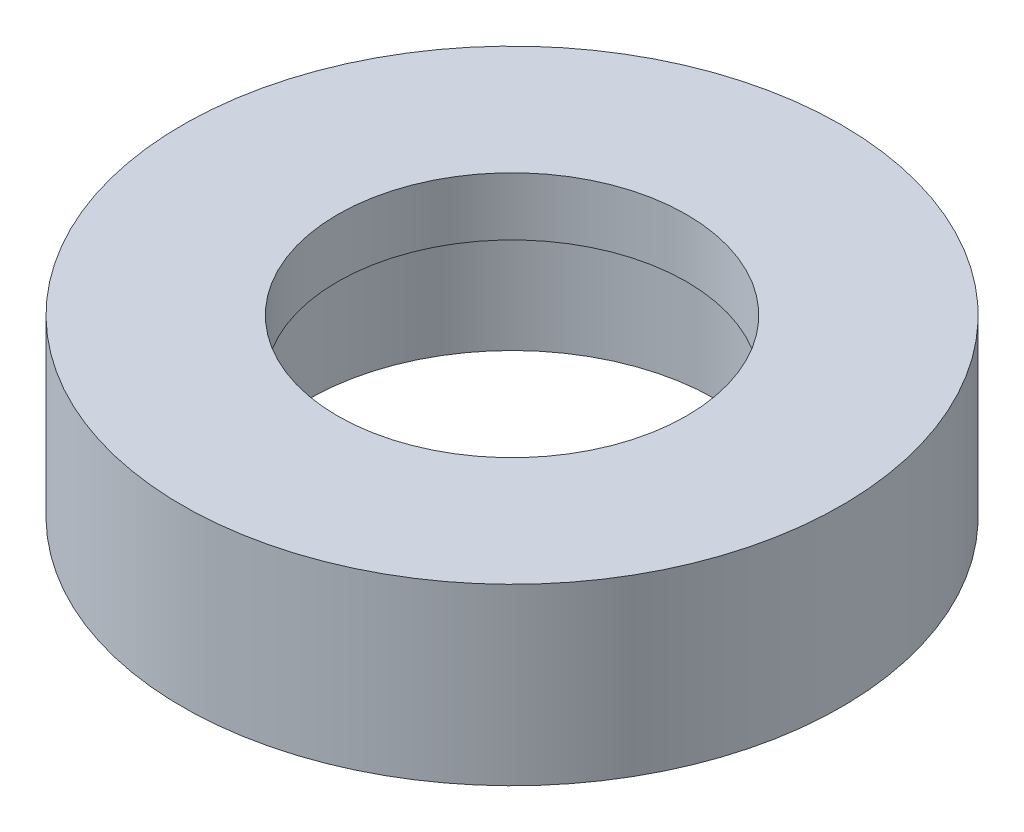
ISO-10303-21;
HEADER;
FILE_DESCRIPTION(('STEP AP214'),'2;1');
FILE_NAME('part.step','',(''),(''),'','','');
FILE_SCHEMA(('AUTOMOTIVE_DESIGN { 1 0 10303 214 1 1 1 1 }'));
ENDSEC;
DATA;
#1=APPLICATION_CONTEXT('core data for automotive mechanical design processes');
#2=APPLICATION_PROTOCOL_DEFINITION('international standard','automotive_design',2000,#1);
#3=PRODUCT_CONTEXT('',#1,'mechanical');
#4=PRODUCT('Part','Part','',(#3));
#5=PRODUCT_RELATED_PRODUCT_CATEGORY('part','',(#4));
#6=PRODUCT_DEFINITION_FORMATION('','',#4);
#7=PRODUCT_DEFINITION_CONTEXT('part definition',#1,'design');
#8=PRODUCT_DEFINITION('design','',#6,#7);
#9=PRODUCT_DEFINITION_SHAPE('','',#8);
#10=(LENGTH_UNIT() NAMED_UNIT(*) SI_UNIT(.MILLI.,.METRE.));
#11=(NAMED_UNIT(*) PLANE_ANGLE_UNIT() SI_UNIT($,.RADIAN.));
#12=(NAMED_UNIT(*) SI_UNIT($,.STERADIAN.) SOLID_ANGLE_UNIT());
#13=UNCERTAINTY_MEASURE_WITH_UNIT(LENGTH_MEASURE(1.E-05),#10,'distance_accuracy_value','');
#14=(GEOMETRIC_REPRESENTATION_CONTEXT(3) GLOBAL_UNCERTAINTY_ASSIGNED_CONTEXT((#13)) GLOBAL_UNIT_ASSIGNED_CONTEXT((#10,
#11,#12)) REPRESENTATION_CONTEXT('',''));
#15=CARTESIAN_POINT('',(0.,0.,0.));
#16=DIRECTION('',(0.,0.,1.));
#17=DIRECTION('',(1.,0.,0.));
#18=AXIS2_PLACEMENT_3D('',#15,#16,#17);
#19=CARTESIAN_POINT('',(0.,0.,0.));
#20=DIRECTION('',(0.,-1.,0.));
#21=DIRECTION('',(0.,0.,-1.));
#22=AXIS2_PLACEMENT_3D('',#19,#20,#21);
#23=CYLINDRICAL_SURFACE('',#22,34.);
#24=CARTESIAN_POINT('',(0.,-0.499416231257493,0.));
#25=DIRECTION('',(0.,-1.,0.));
#26=DIRECTION('',(0.,0.,-1.));
#27=AXIS2_PLACEMENT_3D('',#24,#25,#26);
#28=CIRCLE('',#27,34.);
#29=CARTESIAN_POINT('',(0.,-0.499416231257493,-34.));
#30=VERTEX_POINT('',#29);
#31=EDGE_CURVE('E10',#30,#30,#28,.T.);
#32=ORIENTED_EDGE('',*,*,#31,.F.);
#33=EDGE_LOOP('',(#32));
#34=FACE_BOUND('',#33,.T.);
#35=CARTESIAN_POINT('',(0.,17.5005837687425,0.));
#36=DIRECTION('',(0.,-1.,0.));
#37=DIRECTION('',(0.,0.,-1.));
#38=AXIS2_PLACEMENT_3D('',#35,#36,#37);
#39=CIRCLE('',#38,34.);
#40=CARTESIAN_POINT('',(0.,17.5005837687425,-34.));
#41=VERTEX_POINT('',#40);
#42=EDGE_CURVE('E52',#41,#41,#39,.T.);
#43=ORIENTED_EDGE('',*,*,#42,.T.);
#44=EDGE_LOOP('',(#43));
#45=FACE_BOUND('',#44,.T.);
#46=ADVANCED_FACE('F30',(#34,#45),#23,.T.);
#47=CARTESIAN_POINT('',(-34.,-0.499416231257493,0.));
#48=DIRECTION('',(0.,1.,0.));
#49=DIRECTION('',(0.,0.,1.));
#50=AXIS2_PLACEMENT_3D('',#47,#48,#49);
#51=PLANE('',#50);
#52=CARTESIAN_POINT('',(0.,-0.499416231257493,27.6));
#53=DIRECTION('',(0.,-1.,0.));
#54=DIRECTION('',(0.,0.,-1.));
#55=AXIS2_PLACEMENT_3D('',#52,#53,#54);
#56=CIRCLE('',#55,3.);
#57=CARTESIAN_POINT('',(0.,-0.499416231257493,24.6));
#58=VERTEX_POINT('',#57);
#59=EDGE_CURVE('E74',#58,#58,#56,.T.);
#60=ORIENTED_EDGE('',*,*,#59,.F.);
#61=EDGE_LOOP('',(#60));
#62=FACE_BOUND('',#61,.T.);
#63=CARTESIAN_POINT('',(27.6,-0.499416231257493,0.));
#64=DIRECTION('',(0.,-1.,0.));
#65=DIRECTION('',(0.,0.,-1.));
#66=AXIS2_PLACEMENT_3D('',#63,#64,#65);
#67=CIRCLE('',#66,3.);
#68=CARTESIAN_POINT('',(27.6,-0.499416231257493,-3.));
#69=VERTEX_POINT('',#68);
#70=EDGE_CURVE('E68',#69,#69,#67,.T.);
#71=ORIENTED_EDGE('',*,*,#70,.F.);
#72=EDGE_LOOP('',(#71));
#73=FACE_BOUND('',#72,.T.);
#74=CARTESIAN_POINT('',(0.,-0.499416231257493,-27.6));
#75=DIRECTION('',(0.,-1.,0.));
#76=DIRECTION('',(0.,0.,-1.));
#77=AXIS2_PLACEMENT_3D('',#74,#75,#76);
#78=CIRCLE('',#77,3.);
#79=CARTESIAN_POINT('',(0.,-0.499416231257493,-30.6));
#80=VERTEX_POINT('',#79);
#81=EDGE_CURVE('E62',#80,#80,#78,.T.);
#82=ORIENTED_EDGE('',*,*,#81,.F.);
#83=EDGE_LOOP('',(#82));
#84=FACE_BOUND('',#83,.T.);
#85=CARTESIAN_POINT('',(-27.6,-0.499416231257493,0.));
#86=DIRECTION('',(0.,-1.,0.));
#87=DIRECTION('',(0.,0.,-1.));
#88=AXIS2_PLACEMENT_3D('',#85,#86,#87);
#89=CIRCLE('',#88,3.);
#90=CARTESIAN_POINT('',(-27.6,-0.499416231257493,-3.));
#91=VERTEX_POINT('',#90);
#92=EDGE_CURVE('E56',#91,#91,#89,.T.);
#93=ORIENTED_EDGE('',*,*,#92,.F.);
#94=EDGE_LOOP('',(#93));
#95=FACE_BOUND('',#94,.T.);
#96=CARTESIAN_POINT('',(0.,-0.499416231257493,0.));
#97=DIRECTION('',(0.,-1.,0.));
#98=DIRECTION('',(0.,0.,-1.));
#99=AXIS2_PLACEMENT_3D('',#96,#97,#98);
#100=CIRCLE('',#99,21.);
#101=CARTESIAN_POINT('',(0.,-0.499416231257493,-21.));
#102=VERTEX_POINT('',#101);
#103=EDGE_CURVE('E36',#102,#102,#100,.T.);
#104=ORIENTED_EDGE('',*,*,#103,.F.);
#105=EDGE_LOOP('',(#104));
#106=FACE_BOUND('',#105,.T.);
#107=ORIENTED_EDGE('',*,*,#31,.T.);
#108=EDGE_LOOP('',(#107));
#109=FACE_BOUND('',#108,.T.);
#110=ADVANCED_FACE('F89',(#62,#73,#84,#95,#106,#109),#51,.F.);
#111=CARTESIAN_POINT('',(0.,0.,0.));
#112=DIRECTION('',(0.,-1.,0.));
#113=DIRECTION('',(0.,0.,-1.));
#114=AXIS2_PLACEMENT_3D('',#111,#112,#113);
#115=CYLINDRICAL_SURFACE('',#114,21.);
#116=CARTESIAN_POINT('',(0.,11.5005837687425,0.));
#117=DIRECTION('',(0.,-1.,0.));
#118=DIRECTION('',(0.,0.,-1.));
#119=AXIS2_PLACEMENT_3D('',#116,#117,#118);
#120=CIRCLE('',#119,21.);
#121=CARTESIAN_POINT('',(0.,11.5005837687425,-21.));
#122=VERTEX_POINT('',#121);
#123=EDGE_CURVE('E40',#122,#122,#120,.T.);
#124=ORIENTED_EDGE('',*,*,#123,.F.);
#125=EDGE_LOOP('',(#124));
#126=FACE_BOUND('',#125,.T.);
#127=ORIENTED_EDGE('',*,*,#103,.T.);
#128=EDGE_LOOP('',(#127));
#129=FACE_BOUND('',#128,.T.);
#130=ADVANCED_FACE('F92',(#126,#129),#115,.F.);
#131=CARTESIAN_POINT('',(-21.,11.5005837687425,0.));
#132=DIRECTION('',(0.,1.,0.));
#133=DIRECTION('',(0.,0.,1.));
#134=AXIS2_PLACEMENT_3D('',#131,#132,#133);
#135=PLANE('',#134);
#136=CARTESIAN_POINT('',(0.,11.5005837687425,0.));
#137=DIRECTION('',(0.,-1.,0.));
#138=DIRECTION('',(0.,0.,-1.));
#139=AXIS2_PLACEMENT_3D('',#136,#137,#138);
#140=CIRCLE('',#139,18.);
#141=CARTESIAN_POINT('',(0.,11.5005837687425,-18.));
#142=VERTEX_POINT('',#141);
#143=EDGE_CURVE('E44',#142,#142,#140,.T.);
#144=ORIENTED_EDGE('',*,*,#143,.F.);
#145=EDGE_LOOP('',(#144));
#146=FACE_BOUND('',#145,.T.);
#147=ORIENTED_EDGE('',*,*,#123,.T.);
#148=EDGE_LOOP('',(#147));
#149=FACE_BOUND('',#148,.T.);
#150=ADVANCED_FACE('F128',(#146,#149),#135,.F.);
#151=CARTESIAN_POINT('',(0.,0.,0.));
#152=DIRECTION('',(0.,-1.,0.));
#153=DIRECTION('',(0.,0.,-1.));
#154=AXIS2_PLACEMENT_3D('',#151,#152,#153);
#155=CYLINDRICAL_SURFACE('',#154,18.);
#156=CARTESIAN_POINT('',(0.,17.5005837687425,0.));
#157=DIRECTION('',(0.,-1.,0.));
#158=DIRECTION('',(0.,0.,-1.));
#159=AXIS2_PLACEMENT_3D('',#156,#157,#158);
#160=CIRCLE('',#159,18.);
#161=CARTESIAN_POINT('',(0.,17.5005837687425,-18.));
#162=VERTEX_POINT('',#161);
#163=EDGE_CURVE('E49',#162,#162,#160,.T.);
#164=ORIENTED_EDGE('',*,*,#163,.F.);
#165=EDGE_LOOP('',(#164));
#166=FACE_BOUND('',#165,.T.);
#167=ORIENTED_EDGE('',*,*,#143,.T.);
#168=EDGE_LOOP('',(#167));
#169=FACE_BOUND('',#168,.T.);
#170=ADVANCED_FACE('F113',(#166,#169),#155,.F.);
#171=CARTESIAN_POINT('',(-18.,17.5005837687425,0.));
#172=DIRECTION('',(0.,-1.,0.));
#173=DIRECTION('',(0.,0.,-1.));
#174=AXIS2_PLACEMENT_3D('',#171,#172,#173);
#175=PLANE('',#174);
#176=ORIENTED_EDGE('',*,*,#42,.F.);
#177=EDGE_LOOP('',(#176));
#178=FACE_BOUND('',#177,.T.);
#179=ORIENTED_EDGE('',*,*,#163,.T.);
#180=EDGE_LOOP('',(#179));
#181=FACE_BOUND('',#180,.T.);
#182=ADVANCED_FACE('F103',(#178,#181),#175,.F.);
#183=CARTESIAN_POINT('',(-27.6,9.50058376874251,0.));
#184=DIRECTION('',(0.,-1.,0.));
#185=DIRECTION('',(0.,0.,-1.));
#186=AXIS2_PLACEMENT_3D('',#183,#184,#185);
#187=CYLINDRICAL_SURFACE('',#186,3.);
#188=CARTESIAN_POINT('',(-27.6,9.50058376874251,0.));
#189=DIRECTION('',(0.,-1.,0.));
#190=DIRECTION('',(0.,0.,-1.));
#191=AXIS2_PLACEMENT_3D('',#188,#189,#190);
#192=CIRCLE('',#191,3.);
#193=CARTESIAN_POINT('',(-27.6,9.50058376874251,-3.));
#194=VERTEX_POINT('',#193);
#195=EDGE_CURVE('E59',#194,#194,#192,.T.);
#196=ORIENTED_EDGE('',*,*,#195,.F.);
#197=EDGE_LOOP('',(#196));
#198=FACE_BOUND('',#197,.T.);
#199=ORIENTED_EDGE('',*,*,#92,.T.);
#200=EDGE_LOOP('',(#199));
#201=FACE_BOUND('',#200,.T.);
#202=ADVANCED_FACE('F100',(#198,#201),#187,.F.);
#203=CARTESIAN_POINT('',(-27.6,9.50058376874251,0.));
#204=DIRECTION('',(0.,-1.,0.));
#205=DIRECTION('',(0.,0.,-1.));
#206=AXIS2_PLACEMENT_3D('',#203,#204,#205);
#207=PLANE('',#206);
#208=ORIENTED_EDGE('',*,*,#195,.T.);
#209=EDGE_LOOP('',(#208));
#210=FACE_BOUND('',#209,.T.);
#211=ADVANCED_FACE('F102',(#210),#207,.T.);
#212=CARTESIAN_POINT('',(0.,9.50058376874251,-27.6));
#213=DIRECTION('',(0.,-1.,0.));
#214=DIRECTION('',(0.,0.,-1.));
#215=AXIS2_PLACEMENT_3D('',#212,#213,#214);
#216=CYLINDRICAL_SURFACE('',#215,3.);
#217=CARTESIAN_POINT('',(0.,9.50058376874251,-27.6));
#218=DIRECTION('',(0.,-1.,0.));
#219=DIRECTION('',(0.,0.,-1.));
#220=AXIS2_PLACEMENT_3D('',#217,#218,#219);
#221=CIRCLE('',#220,3.);
#222=CARTESIAN_POINT('',(0.,9.50058376874251,-30.6));
#223=VERTEX_POINT('',#222);
#224=EDGE_CURVE('E65',#223,#223,#221,.T.);
#225=ORIENTED_EDGE('',*,*,#224,.F.);
#226=EDGE_LOOP('',(#225));
#227=FACE_BOUND('',#226,.T.);
#228=ORIENTED_EDGE('',*,*,#81,.T.);
#229=EDGE_LOOP('',(#228));
#230=FACE_BOUND('',#229,.T.);
#231=ADVANCED_FACE('F110',(#227,#230),#216,.F.);
#232=CARTESIAN_POINT('',(0.,9.50058376874251,-27.6));
#233=DIRECTION('',(0.,-1.,0.));
#234=DIRECTION('',(0.,0.,-1.));
#235=AXIS2_PLACEMENT_3D('',#232,#233,#234);
#236=PLANE('',#235);
#237=ORIENTED_EDGE('',*,*,#224,.T.);
#238=EDGE_LOOP('',(#237));
#239=FACE_BOUND('',#238,.T.);
#240=ADVANCED_FACE('F179',(#239),#236,.T.);
#241=CARTESIAN_POINT('',(27.6,9.50058376874251,0.));
#242=DIRECTION('',(0.,-1.,0.));
#243=DIRECTION('',(0.,0.,-1.));
#244=AXIS2_PLACEMENT_3D('',#241,#242,#243);
#245=CYLINDRICAL_SURFACE('',#244,3.);
#246=CARTESIAN_POINT('',(27.6,9.50058376874251,0.));
#247=DIRECTION('',(0.,-1.,0.));
#248=DIRECTION('',(0.,0.,-1.));
#249=AXIS2_PLACEMENT_3D('',#246,#247,#248);
#250=CIRCLE('',#249,3.);
#251=CARTESIAN_POINT('',(27.6,9.50058376874251,-3.));
#252=VERTEX_POINT('',#251);
#253=EDGE_CURVE('E71',#252,#252,#250,.T.);
#254=ORIENTED_EDGE('',*,*,#253,.F.);
#255=EDGE_LOOP('',(#254));
#256=FACE_BOUND('',#255,.T.);
#257=ORIENTED_EDGE('',*,*,#70,.T.);
#258=EDGE_LOOP('',(#257));
#259=FACE_BOUND('',#258,.T.);
#260=ADVANCED_FACE('F189',(#256,#259),#245,.F.);
#261=CARTESIAN_POINT('',(27.6,9.50058376874251,0.));
#262=DIRECTION('',(0.,-1.,0.));
#263=DIRECTION('',(0.,0.,-1.));
#264=AXIS2_PLACEMENT_3D('',#261,#262,#263);
#265=PLANE('',#264);
#266=ORIENTED_EDGE('',*,*,#253,.T.);
#267=EDGE_LOOP('',(#266));
#268=FACE_BOUND('',#267,.T.);
#269=ADVANCED_FACE('F85',(#268),#265,.T.);
#270=CARTESIAN_POINT('',(0.,9.50058376874251,27.6));
#271=DIRECTION('',(0.,-1.,0.));
#272=DIRECTION('',(0.,0.,-1.));
#273=AXIS2_PLACEMENT_3D('',#270,#271,#272);
#274=CYLINDRICAL_SURFACE('',#273,3.);
#275=CARTESIAN_POINT('',(0.,9.50058376874251,27.6));
#276=DIRECTION('',(0.,-1.,0.));
#277=DIRECTION('',(0.,0.,-1.));
#278=AXIS2_PLACEMENT_3D('',#275,#276,#277);
#279=CIRCLE('',#278,3.);
#280=CARTESIAN_POINT('',(0.,9.50058376874251,24.6));
#281=VERTEX_POINT('',#280);
#282=EDGE_CURVE('E55',#281,#281,#279,.T.);
#283=ORIENTED_EDGE('',*,*,#282,.F.);
#284=EDGE_LOOP('',(#283));
#285=FACE_BOUND('',#284,.T.);
#286=ORIENTED_EDGE('',*,*,#59,.T.);
#287=EDGE_LOOP('',(#286));
#288=FACE_BOUND('',#287,.T.);
#289=ADVANCED_FACE('F82',(#285,#288),#274,.F.);
#290=CARTESIAN_POINT('',(0.,9.50058376874251,27.6));
#291=DIRECTION('',(0.,-1.,0.));
#292=DIRECTION('',(0.,0.,-1.));
#293=AXIS2_PLACEMENT_3D('',#290,#291,#292);
#294=PLANE('',#293);
#295=ORIENTED_EDGE('',*,*,#282,.T.);
#296=EDGE_LOOP('',(#295));
#297=FACE_BOUND('',#296,.T.);
#298=ADVANCED_FACE('F80',(#297),#294,.T.);
#299=CLOSED_SHELL('',(#46,#110,#130,#150,#170,#182,#202,#211,#231,#240,#260,#269,#289,#298));
#300=MANIFOLD_SOLID_BREP('B2',#299);
#301=ADVANCED_BREP_SHAPE_REPRESENTATION('',(#18,#300),#14);
#302=SHAPE_DEFINITION_REPRESENTATION(#9,#301);
ENDSEC;
END-ISO-10303-21;
